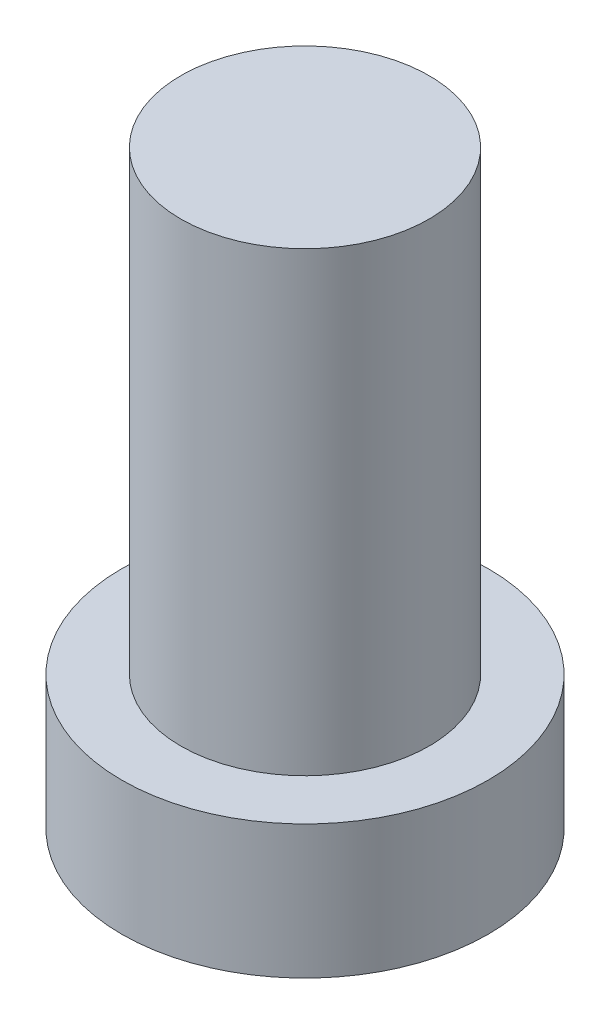
ISO-10303-21;
HEADER;
FILE_DESCRIPTION(('STEP AP214'),'2;1');
FILE_NAME('part.step','',(''),(''),'','','');
FILE_SCHEMA(('AUTOMOTIVE_DESIGN { 1 0 10303 214 1 1 1 1 }'));
ENDSEC;
DATA;
#1=APPLICATION_CONTEXT('core data for automotive mechanical design processes');
#2=APPLICATION_PROTOCOL_DEFINITION('international standard','automotive_design',2000,#1);
#3=PRODUCT_CONTEXT('',#1,'mechanical');
#4=PRODUCT('Part','Part','',(#3));
#5=PRODUCT_RELATED_PRODUCT_CATEGORY('part','',(#4));
#6=PRODUCT_DEFINITION_FORMATION('','',#4);
#7=PRODUCT_DEFINITION_CONTEXT('part definition',#1,'design');
#8=PRODUCT_DEFINITION('design','',#6,#7);
#9=PRODUCT_DEFINITION_SHAPE('','',#8);
#10=(LENGTH_UNIT() NAMED_UNIT(*) SI_UNIT(.MILLI.,.METRE.));
#11=(NAMED_UNIT(*) PLANE_ANGLE_UNIT() SI_UNIT($,.RADIAN.));
#12=(NAMED_UNIT(*) SI_UNIT($,.STERADIAN.) SOLID_ANGLE_UNIT());
#13=UNCERTAINTY_MEASURE_WITH_UNIT(LENGTH_MEASURE(1.E-05),#10,'distance_accuracy_value','');
#14=(GEOMETRIC_REPRESENTATION_CONTEXT(3) GLOBAL_UNCERTAINTY_ASSIGNED_CONTEXT((#13)) GLOBAL_UNIT_ASSIGNED_CONTEXT((#10,
#11,#12)) REPRESENTATION_CONTEXT('',''));
#15=CARTESIAN_POINT('',(0.,0.,0.));
#16=DIRECTION('',(0.,0.,1.));
#17=DIRECTION('',(1.,0.,0.));
#18=AXIS2_PLACEMENT_3D('',#15,#16,#17);
#19=CARTESIAN_POINT('',(0.,4.3,0.));
#20=DIRECTION('',(0.,-1.,0.));
#21=DIRECTION('',(0.,0.,-1.));
#22=AXIS2_PLACEMENT_3D('',#19,#20,#21);
#23=CYLINDRICAL_SURFACE('',#22,5.9);
#24=CARTESIAN_POINT('',(0.,4.3,0.));
#25=DIRECTION('',(0.,1.,0.));
#26=DIRECTION('',(0.,0.,1.));
#27=AXIS2_PLACEMENT_3D('',#24,#25,#26);
#28=CIRCLE('',#27,5.9);
#29=CARTESIAN_POINT('',(0.,4.3,-5.9));
#30=VERTEX_POINT('',#29);
#31=EDGE_CURVE('E44',#30,#30,#28,.T.);
#32=CARTESIAN_POINT('',(0.,0.,0.));
#33=DIRECTION('',(0.,1.,0.));
#34=DIRECTION('',(0.,0.,1.));
#35=AXIS2_PLACEMENT_3D('',#32,#33,#34);
#36=CIRCLE('',#35,5.9);
#37=CARTESIAN_POINT('',(0.,0.,-5.9));
#38=VERTEX_POINT('',#37);
#39=EDGE_CURVE('E40',#38,#38,#36,.T.);
#40=CARTESIAN_POINT('',(0.,4.3,-5.9));
#41=CARTESIAN_POINT('',(0.,4.25520833333333,-5.9));
#42=CARTESIAN_POINT('',(0.,4.21041666666667,-5.9));
#43=CARTESIAN_POINT('',(0.,4.12083333333333,-5.9));
#44=CARTESIAN_POINT('',(0.,4.07604166666667,-5.9));
#45=CARTESIAN_POINT('',(0.,3.98645833333333,-5.9));
#46=CARTESIAN_POINT('',(0.,3.94166666666667,-5.9));
#47=CARTESIAN_POINT('',(0.,3.85208333333333,-5.9));
#48=CARTESIAN_POINT('',(0.,3.80729166666667,-5.9));
#49=CARTESIAN_POINT('',(0.,3.71770833333333,-5.9));
#50=CARTESIAN_POINT('',(0.,3.67291666666667,-5.9));
#51=CARTESIAN_POINT('',(0.,3.58333333333333,-5.9));
#52=CARTESIAN_POINT('',(0.,3.53854166666667,-5.9));
#53=CARTESIAN_POINT('',(0.,3.44895833333333,-5.9));
#54=CARTESIAN_POINT('',(0.,3.40416666666667,-5.9));
#55=CARTESIAN_POINT('',(0.,3.31458333333333,-5.9));
#56=CARTESIAN_POINT('',(0.,3.26979166666667,-5.9));
#57=CARTESIAN_POINT('',(0.,3.18020833333333,-5.9));
#58=CARTESIAN_POINT('',(0.,3.13541666666667,-5.9));
#59=CARTESIAN_POINT('',(0.,3.04583333333333,-5.9));
#60=CARTESIAN_POINT('',(0.,3.00104166666667,-5.9));
#61=CARTESIAN_POINT('',(0.,2.91145833333333,-5.9));
#62=CARTESIAN_POINT('',(0.,2.86666666666667,-5.9));
#63=CARTESIAN_POINT('',(0.,2.77708333333333,-5.9));
#64=CARTESIAN_POINT('',(0.,2.73229166666667,-5.9));
#65=CARTESIAN_POINT('',(0.,2.64270833333333,-5.9));
#66=CARTESIAN_POINT('',(0.,2.59791666666667,-5.9));
#67=CARTESIAN_POINT('',(0.,2.50833333333333,-5.9));
#68=CARTESIAN_POINT('',(0.,2.46354166666667,-5.9));
#69=CARTESIAN_POINT('',(0.,2.37395833333333,-5.9));
#70=CARTESIAN_POINT('',(0.,2.32916666666667,-5.9));
#71=CARTESIAN_POINT('',(0.,2.23958333333333,-5.9));
#72=CARTESIAN_POINT('',(0.,2.19479166666667,-5.9));
#73=CARTESIAN_POINT('',(0.,2.10520833333333,-5.9));
#74=CARTESIAN_POINT('',(0.,2.06041666666667,-5.9));
#75=CARTESIAN_POINT('',(0.,1.97083333333333,-5.9));
#76=CARTESIAN_POINT('',(0.,1.92604166666667,-5.9));
#77=CARTESIAN_POINT('',(0.,1.83645833333333,-5.9));
#78=CARTESIAN_POINT('',(0.,1.79166666666667,-5.9));
#79=CARTESIAN_POINT('',(0.,1.70208333333333,-5.9));
#80=CARTESIAN_POINT('',(0.,1.65729166666667,-5.9));
#81=CARTESIAN_POINT('',(0.,1.56770833333333,-5.9));
#82=CARTESIAN_POINT('',(0.,1.52291666666667,-5.9));
#83=CARTESIAN_POINT('',(0.,1.43333333333333,-5.9));
#84=CARTESIAN_POINT('',(0.,1.38854166666667,-5.9));
#85=CARTESIAN_POINT('',(0.,1.29895833333333,-5.9));
#86=CARTESIAN_POINT('',(0.,1.25416666666667,-5.9));
#87=CARTESIAN_POINT('',(0.,1.16458333333333,-5.9));
#88=CARTESIAN_POINT('',(0.,1.11979166666667,-5.9));
#89=CARTESIAN_POINT('',(0.,1.03020833333333,-5.9));
#90=CARTESIAN_POINT('',(0.,0.985416666666666,-5.9));
#91=CARTESIAN_POINT('',(0.,0.895833333333333,-5.9));
#92=CARTESIAN_POINT('',(0.,0.851041666666666,-5.9));
#93=CARTESIAN_POINT('',(0.,0.761458333333333,-5.9));
#94=CARTESIAN_POINT('',(0.,0.716666666666666,-5.9));
#95=CARTESIAN_POINT('',(0.,0.627083333333333,-5.9));
#96=CARTESIAN_POINT('',(0.,0.582291666666666,-5.9));
#97=CARTESIAN_POINT('',(0.,0.492708333333333,-5.9));
#98=CARTESIAN_POINT('',(0.,0.447916666666666,-5.9));
#99=CARTESIAN_POINT('',(0.,0.358333333333333,-5.9));
#100=CARTESIAN_POINT('',(0.,0.313541666666666,-5.9));
#101=CARTESIAN_POINT('',(0.,0.223958333333332,-5.9));
#102=CARTESIAN_POINT('',(0.,0.179166666666666,-5.9));
#103=CARTESIAN_POINT('',(0.,0.0895833333333324,-5.9));
#104=CARTESIAN_POINT('',(0.,0.0447916666666658,-5.9));
#105=CARTESIAN_POINT('',(0.,0.,-5.9));
#106=B_SPLINE_CURVE_WITH_KNOTS('',3,(#40,#41,#42,#43,#44,#45,#46,#47,#48,#49,#50,#51,#52,#53,
#54,#55,#56,#57,#58,#59,#60,#61,#62,#63,#64,#65,#66,#67,#68,#69,#70,#71,#72,#73,#74,#75,#76,#77,
#78,#79,#80,#81,#82,#83,#84,#85,#86,#87,#88,#89,#90,#91,#92,#93,#94,#95,#96,#97,#98,#99,#100,
#101,#102,#103,#104,#105),.UNSPECIFIED.,.F.,.F.,(4,2,2,2,2,2,2,2,2,2,2,2,2,2,2,2,2,2,2,2,2,2,2,
2,2,2,2,2,2,2,2,2,4),(0.,0.134375,0.26875,0.403124999999999,0.5375,0.671875,0.80625,0.940625,
1.075,1.209375,1.34375,1.478125,1.6125,1.746875,1.88125,2.015625,2.15,2.284375,2.41875,2.553125,
2.6875,2.821875,2.95625,3.090625,3.225,3.359375,3.49375,3.628125,3.7625,3.896875,4.03125,
4.165625,4.3),.UNSPECIFIED.);
#107=EDGE_CURVE('BSEAM37',#30,#38,#106,.T.);
#108=ORIENTED_EDGE('',*,*,#31,.F.);
#109=ORIENTED_EDGE('',*,*,#39,.T.);
#110=ORIENTED_EDGE('',*,*,#107,.T.);
#111=ORIENTED_EDGE('',*,*,#107,.F.);
#112=EDGE_LOOP('',(#108,#110,#109,#111));
#113=FACE_BOUND('',#112,.T.);
#114=ADVANCED_FACE('F37',(#113),#23,.T.);
#115=CARTESIAN_POINT('',(0.,4.3,0.));
#116=DIRECTION('',(0.,1.,0.));
#117=DIRECTION('',(0.,0.,1.));
#118=AXIS2_PLACEMENT_3D('',#115,#116,#117);
#119=PLANE('',#118);
#120=CARTESIAN_POINT('',(0.,4.3,0.));
#121=DIRECTION('',(0.,1.,0.));
#122=DIRECTION('',(0.,0.,1.));
#123=AXIS2_PLACEMENT_3D('',#120,#121,#122);
#124=CIRCLE('',#123,4.);
#125=CARTESIAN_POINT('',(0.,4.3,4.));
#126=VERTEX_POINT('',#125);
#127=EDGE_CURVE('E10',#126,#126,#124,.T.);
#128=ORIENTED_EDGE('',*,*,#127,.F.);
#129=EDGE_LOOP('',(#128));
#130=FACE_BOUND('',#129,.T.);
#131=ORIENTED_EDGE('',*,*,#31,.T.);
#132=EDGE_LOOP('',(#131));
#133=FACE_BOUND('',#132,.T.);
#134=ADVANCED_FACE('F61',(#130,#133),#119,.T.);
#135=CARTESIAN_POINT('',(0.,0.,0.));
#136=DIRECTION('',(0.,1.,0.));
#137=DIRECTION('',(0.,0.,1.));
#138=AXIS2_PLACEMENT_3D('',#135,#136,#137);
#139=PLANE('',#138);
#140=ORIENTED_EDGE('',*,*,#39,.F.);
#141=EDGE_LOOP('',(#140));
#142=FACE_BOUND('',#141,.T.);
#143=ADVANCED_FACE('F58',(#142),#139,.F.);
#144=CARTESIAN_POINT('',(0.,19.,0.));
#145=DIRECTION('',(0.,-1.,0.));
#146=DIRECTION('',(0.,0.,-1.));
#147=AXIS2_PLACEMENT_3D('',#144,#145,#146);
#148=CYLINDRICAL_SURFACE('',#147,4.);
#149=CARTESIAN_POINT('',(0.,19.,0.));
#150=DIRECTION('',(0.,1.,0.));
#151=DIRECTION('',(0.,0.,1.));
#152=AXIS2_PLACEMENT_3D('',#149,#150,#151);
#153=CIRCLE('',#152,4.);
#154=CARTESIAN_POINT('',(0.,19.,4.));
#155=VERTEX_POINT('',#154);
#156=EDGE_CURVE('E50',#155,#155,#153,.T.);
#157=ORIENTED_EDGE('',*,*,#156,.F.);
#158=EDGE_LOOP('',(#157));
#159=FACE_BOUND('',#158,.T.);
#160=ORIENTED_EDGE('',*,*,#127,.T.);
#161=EDGE_LOOP('',(#160));
#162=FACE_BOUND('',#161,.T.);
#163=ADVANCED_FACE('F60',(#159,#162),#148,.T.);
#164=CARTESIAN_POINT('',(0.,19.,0.));
#165=DIRECTION('',(0.,1.,0.));
#166=DIRECTION('',(0.,0.,1.));
#167=AXIS2_PLACEMENT_3D('',#164,#165,#166);
#168=PLANE('',#167);
#169=ORIENTED_EDGE('',*,*,#156,.T.);
#170=EDGE_LOOP('',(#169));
#171=FACE_BOUND('',#170,.T.);
#172=ADVANCED_FACE('F67',(#171),#168,.T.);
#173=CLOSED_SHELL('',(#114,#134,#143,#163,#172));
#174=MANIFOLD_SOLID_BREP('B2',#173);
#175=ADVANCED_BREP_SHAPE_REPRESENTATION('',(#18,#174),#14);
#176=SHAPE_DEFINITION_REPRESENTATION(#9,#175);
ENDSEC;
END-ISO-10303-21;
